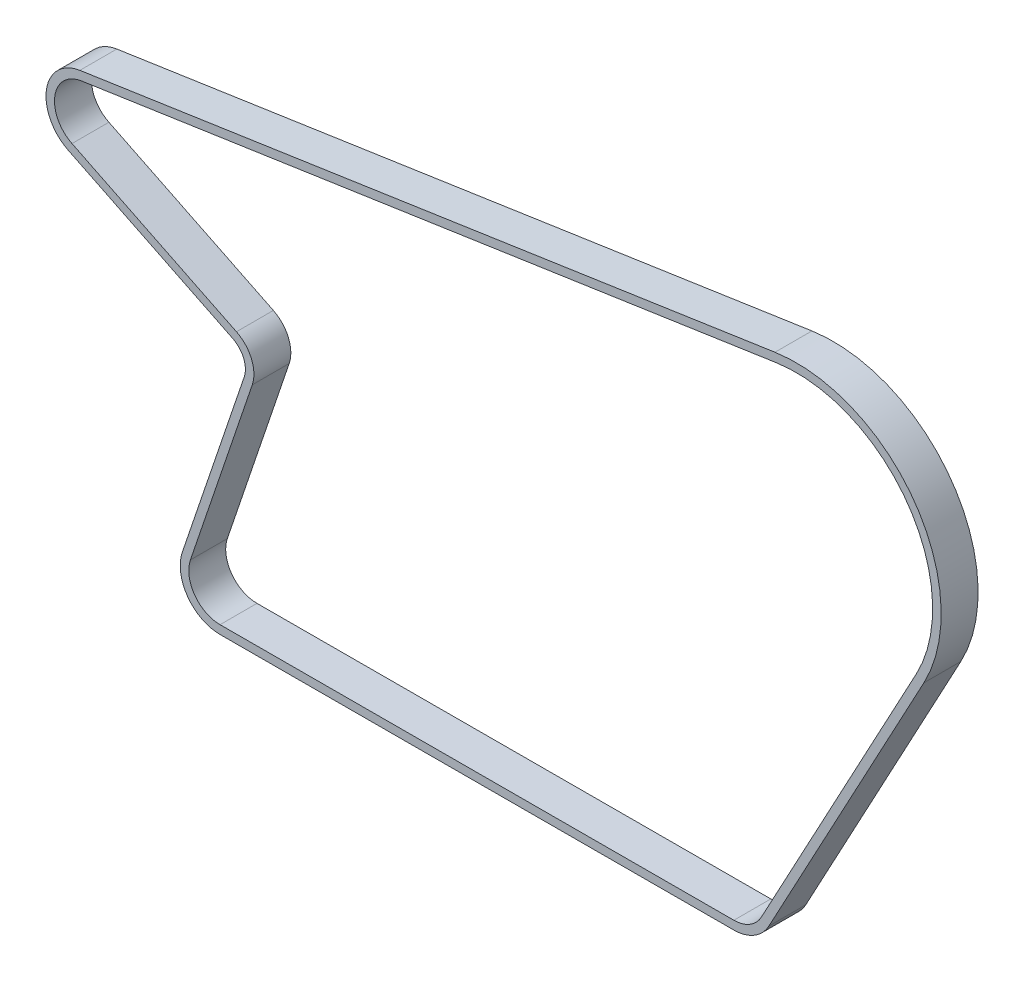
ISO-10303-21;
HEADER;
FILE_DESCRIPTION(('STEP AP214'),'2;1');
FILE_NAME('part.step','',(''),(''),'','','');
FILE_SCHEMA(('AUTOMOTIVE_DESIGN { 1 0 10303 214 1 1 1 1 }'));
ENDSEC;
DATA;
#1=APPLICATION_CONTEXT('core data for automotive mechanical design processes');
#2=APPLICATION_PROTOCOL_DEFINITION('international standard','automotive_design',2000,#1);
#3=PRODUCT_CONTEXT('',#1,'mechanical');
#4=PRODUCT('Part','Part','',(#3));
#5=PRODUCT_RELATED_PRODUCT_CATEGORY('part','',(#4));
#6=PRODUCT_DEFINITION_FORMATION('','',#4);
#7=PRODUCT_DEFINITION_CONTEXT('part definition',#1,'design');
#8=PRODUCT_DEFINITION('design','',#6,#7);
#9=PRODUCT_DEFINITION_SHAPE('','',#8);
#10=(LENGTH_UNIT() NAMED_UNIT(*) SI_UNIT(.MILLI.,.METRE.));
#11=(NAMED_UNIT(*) PLANE_ANGLE_UNIT() SI_UNIT($,.RADIAN.));
#12=(NAMED_UNIT(*) SI_UNIT($,.STERADIAN.) SOLID_ANGLE_UNIT());
#13=UNCERTAINTY_MEASURE_WITH_UNIT(LENGTH_MEASURE(1.E-05),#10,'distance_accuracy_value','');
#14=(GEOMETRIC_REPRESENTATION_CONTEXT(3) GLOBAL_UNCERTAINTY_ASSIGNED_CONTEXT((#13)) GLOBAL_UNIT_ASSIGNED_CONTEXT((#10,
#11,#12)) REPRESENTATION_CONTEXT('',''));
#15=CARTESIAN_POINT('',(0.,0.,0.));
#16=DIRECTION('',(0.,0.,1.));
#17=DIRECTION('',(1.,0.,0.));
#18=AXIS2_PLACEMENT_3D('',#15,#16,#17);
#19=CARTESIAN_POINT('',(-2.80678258413047E-09,-5.82048298447546E-10,-3.));
#20=DIRECTION('',(0.,0.,1.));
#21=DIRECTION('',(1.,0.,0.));
#22=AXIS2_PLACEMENT_3D('',#19,#20,#21);
#23=CYLINDRICAL_SURFACE('',#22,14.);
#24=DIRECTION('',(0.,0.,1.));
#25=VECTOR('',#24,1.);
#26=CARTESIAN_POINT('',(-6.16977134039915,-12.5671763597259,-3.00000000000001));
#27=LINE('',#26,#25);
#28=CARTESIAN_POINT('',(-6.16977134039915,-12.5671763597259,-3.00000000000001));
#29=VERTEX_POINT('',#28);
#30=CARTESIAN_POINT('',(-6.16977134039915,-12.5671763597259,9.99999999999999));
#31=VERTEX_POINT('',#30);
#32=EDGE_CURVE('E160',#29,#31,#27,.T.);
#33=ORIENTED_EDGE('',*,*,#32,.T.);
#34=CARTESIAN_POINT('',(-2.80678258413047E-09,-5.82048298447546E-10,10.));
#35=DIRECTION('',(0.,0.,1.));
#36=DIRECTION('',(1.,0.,0.));
#37=AXIS2_PLACEMENT_3D('',#34,#35,#36);
#38=CIRCLE('',#37,14.);
#39=CARTESIAN_POINT('',(-2.06043363480848,13.8475489972773,10.));
#40=VERTEX_POINT('',#39);
#41=EDGE_CURVE('E343',#40,#31,#38,.T.);
#42=ORIENTED_EDGE('',*,*,#41,.F.);
#43=DIRECTION('',(0.,0.,1.));
#44=VECTOR('',#43,1.);
#45=CARTESIAN_POINT('',(-2.06043363480848,13.8475489972773,-3.));
#46=LINE('',#45,#44);
#47=CARTESIAN_POINT('',(-2.06043363480848,13.8475489972773,-3.));
#48=VERTEX_POINT('',#47);
#49=EDGE_CURVE('E12',#48,#40,#46,.T.);
#50=ORIENTED_EDGE('',*,*,#49,.F.);
#51=CARTESIAN_POINT('',(-2.80678258413047E-09,-5.82048298447546E-10,-3.));
#52=DIRECTION('',(0.,0.,1.));
#53=DIRECTION('',(1.,0.,0.));
#54=AXIS2_PLACEMENT_3D('',#51,#52,#53);
#55=CIRCLE('',#54,14.);
#56=EDGE_CURVE('E398',#48,#29,#55,.T.);
#57=ORIENTED_EDGE('',*,*,#56,.T.);
#58=EDGE_LOOP('',(#33,#42,#50,#57));
#59=FACE_BOUND('',#58,.T.);
#60=ADVANCED_FACE('F157',(#59),#23,.T.);
#61=CARTESIAN_POINT('',(242.697793622884,50.2661298760184,-3.));
#62=DIRECTION('',(-0.147173830857266,0.989110642704241,0.));
#63=DIRECTION('',(-0.989110642704241,-0.147173830857266,0.));
#64=AXIS2_PLACEMENT_3D('',#61,#62,#63);
#65=PLANE('',#64);
#66=ORIENTED_EDGE('',*,*,#49,.T.);
#67=DIRECTION('',(-0.989110642704241,-0.147173830857266,0.));
#68=VECTOR('',#67,1.);
#69=CARTESIAN_POINT('',(242.697793622884,50.2661298760184,10.));
#70=LINE('',#69,#68);
#71=CARTESIAN_POINT('',(242.697793622884,50.2661298760184,10.));
#72=VERTEX_POINT('',#71);
#73=EDGE_CURVE('E370',#72,#40,#70,.T.);
#74=ORIENTED_EDGE('',*,*,#73,.F.);
#75=DIRECTION('',(0.,0.,1.));
#76=VECTOR('',#75,1.);
#77=CARTESIAN_POINT('',(242.697793622884,50.2661298760184,-3.));
#78=LINE('',#77,#76);
#79=CARTESIAN_POINT('',(242.697793622884,50.2661298760184,-3.));
#80=VERTEX_POINT('',#79);
#81=EDGE_CURVE('E165',#80,#72,#78,.T.);
#82=ORIENTED_EDGE('',*,*,#81,.F.);
#83=DIRECTION('',(-0.989110642704241,-0.147173830857266,0.));
#84=VECTOR('',#83,1.);
#85=CARTESIAN_POINT('',(242.697793622884,50.2661298760184,-3.));
#86=LINE('',#85,#84);
#87=EDGE_CURVE('E439',#80,#48,#86,.T.);
#88=ORIENTED_EDGE('',*,*,#87,.T.);
#89=EDGE_LOOP('',(#66,#74,#82,#88));
#90=FACE_BOUND('',#89,.T.);
#91=ADVANCED_FACE('F464',(#90),#65,.T.);
#92=CARTESIAN_POINT('',(250.203658996605,-0.178512901897854,-3.));
#93=DIRECTION('',(0.,0.,1.));
#94=DIRECTION('',(1.,0.,0.));
#95=AXIS2_PLACEMENT_3D('',#92,#93,#94);
#96=CYLINDRICAL_SURFACE('',#95,51.);
#97=ORIENTED_EDGE('',*,*,#81,.T.);
#98=CARTESIAN_POINT('',(250.203658996605,-0.178512901897854,10.));
#99=DIRECTION('',(0.,0.,1.));
#100=DIRECTION('',(1.,0.,0.));
#101=AXIS2_PLACEMENT_3D('',#98,#99,#100);
#102=CIRCLE('',#101,51.);
#103=CARTESIAN_POINT('',(295.117855973604,-24.3387055731352,10.));
#104=VERTEX_POINT('',#103);
#105=EDGE_CURVE('E367',#104,#72,#102,.T.);
#106=ORIENTED_EDGE('',*,*,#105,.F.);
#107=DIRECTION('',(0.,0.,1.));
#108=VECTOR('',#107,1.);
#109=CARTESIAN_POINT('',(295.117855973604,-24.3387055731352,-3.));
#110=LINE('',#109,#108);
#111=CARTESIAN_POINT('',(295.117855973604,-24.3387055731352,-3.));
#112=VERTEX_POINT('',#111);
#113=EDGE_CURVE('E443',#112,#104,#110,.T.);
#114=ORIENTED_EDGE('',*,*,#113,.F.);
#115=CARTESIAN_POINT('',(250.203658996605,-0.178512901897854,-3.));
#116=DIRECTION('',(0.,0.,1.));
#117=DIRECTION('',(1.,0.,0.));
#118=AXIS2_PLACEMENT_3D('',#115,#116,#117);
#119=CIRCLE('',#118,51.);
#120=EDGE_CURVE('E436',#112,#80,#119,.T.);
#121=ORIENTED_EDGE('',*,*,#120,.T.);
#122=EDGE_LOOP('',(#97,#106,#114,#121));
#123=FACE_BOUND('',#122,.T.);
#124=ADVANCED_FACE('F493',(#123),#96,.T.);
#125=CARTESIAN_POINT('',(240.534146402057,-125.810722654787,-3.));
#126=DIRECTION('',(0.88067052896077,-0.473729268063478,0.));
#127=DIRECTION('',(0.473729268063478,0.88067052896077,0.));
#128=AXIS2_PLACEMENT_3D('',#125,#126,#127);
#129=PLANE('',#128);
#130=ORIENTED_EDGE('',*,*,#113,.T.);
#131=DIRECTION('',(0.473729268063478,0.88067052896077,0.));
#132=VECTOR('',#131,1.);
#133=CARTESIAN_POINT('',(240.534146402057,-125.810722654787,10.));
#134=LINE('',#133,#132);
#135=CARTESIAN_POINT('',(240.534146402057,-125.810722654787,10.));
#136=VERTEX_POINT('',#135);
#137=EDGE_CURVE('E364',#136,#104,#134,.T.);
#138=ORIENTED_EDGE('',*,*,#137,.F.);
#139=DIRECTION('',(0.,0.,1.));
#140=VECTOR('',#139,1.);
#141=CARTESIAN_POINT('',(240.534146402057,-125.810722654787,-3.));
#142=LINE('',#141,#140);
#143=CARTESIAN_POINT('',(240.534146402057,-125.810722654787,-3.));
#144=VERTEX_POINT('',#143);
#145=EDGE_CURVE('E445',#144,#136,#142,.T.);
#146=ORIENTED_EDGE('',*,*,#145,.F.);
#147=DIRECTION('',(0.473729268063478,0.88067052896077,0.));
#148=VECTOR('',#147,1.);
#149=CARTESIAN_POINT('',(240.534146402057,-125.810722654787,-3.));
#150=LINE('',#149,#148);
#151=EDGE_CURVE('E433',#144,#112,#150,.T.);
#152=ORIENTED_EDGE('',*,*,#151,.T.);
#153=EDGE_LOOP('',(#130,#138,#146,#152));
#154=FACE_BOUND('',#153,.T.);
#155=ADVANCED_FACE('F491',(#154),#129,.T.);
#156=CARTESIAN_POINT('',(228.204758996606,-119.178512901898,-3.));
#157=DIRECTION('',(0.,0.,1.));
#158=DIRECTION('',(1.,0.,0.));
#159=AXIS2_PLACEMENT_3D('',#156,#157,#158);
#160=CYLINDRICAL_SURFACE('',#159,14.);
#161=ORIENTED_EDGE('',*,*,#145,.T.);
#162=CARTESIAN_POINT('',(228.204758996606,-119.178512901898,10.));
#163=DIRECTION('',(0.,0.,1.));
#164=DIRECTION('',(1.,0.,0.));
#165=AXIS2_PLACEMENT_3D('',#162,#163,#164);
#166=CIRCLE('',#165,14.);
#167=CARTESIAN_POINT('',(228.230752901814,-133.178488770338,10.));
#168=VERTEX_POINT('',#167);
#169=EDGE_CURVE('E361',#168,#136,#166,.T.);
#170=ORIENTED_EDGE('',*,*,#169,.F.);
#171=DIRECTION('',(0.,0.,1.));
#172=VECTOR('',#171,1.);
#173=CARTESIAN_POINT('',(228.230752901814,-133.178488770338,-3.));
#174=LINE('',#173,#172);
#175=CARTESIAN_POINT('',(228.230752901814,-133.178488770338,-3.));
#176=VERTEX_POINT('',#175);
#177=EDGE_CURVE('E447',#176,#168,#174,.T.);
#178=ORIENTED_EDGE('',*,*,#177,.F.);
#179=CARTESIAN_POINT('',(228.204758996606,-119.178512901898,-3.));
#180=DIRECTION('',(0.,0.,1.));
#181=DIRECTION('',(1.,0.,0.));
#182=AXIS2_PLACEMENT_3D('',#179,#180,#181);
#183=CIRCLE('',#182,14.);
#184=EDGE_CURVE('E430',#176,#144,#183,.T.);
#185=ORIENTED_EDGE('',*,*,#184,.T.);
#186=EDGE_LOOP('',(#161,#170,#178,#185));
#187=FACE_BOUND('',#186,.T.);
#188=ADVANCED_FACE('F489',(#187),#160,.T.);
#189=CARTESIAN_POINT('',(47.2980577758592,-133.514428444123,-3.));
#190=DIRECTION('',(0.00185670751490131,-0.999998276317116,0.));
#191=DIRECTION('',(0.999998276317117,0.00185670751490131,0.));
#192=AXIS2_PLACEMENT_3D('',#189,#190,#191);
#193=PLANE('',#192);
#194=ORIENTED_EDGE('',*,*,#177,.T.);
#195=DIRECTION('',(0.999998276317117,0.00185670751490131,0.));
#196=VECTOR('',#195,1.);
#197=CARTESIAN_POINT('',(47.2980577758592,-133.514428444123,10.));
#198=LINE('',#197,#196);
#199=CARTESIAN_POINT('',(47.2980577758592,-133.514428444123,10.));
#200=VERTEX_POINT('',#199);
#201=EDGE_CURVE('E358',#200,#168,#198,.T.);
#202=ORIENTED_EDGE('',*,*,#201,.F.);
#203=DIRECTION('',(0.,0.,1.));
#204=VECTOR('',#203,1.);
#205=CARTESIAN_POINT('',(47.2980577758592,-133.514428444123,-3.));
#206=LINE('',#205,#204);
#207=CARTESIAN_POINT('',(47.2980577758592,-133.514428444123,-3.));
#208=VERTEX_POINT('',#207);
#209=EDGE_CURVE('E449',#208,#200,#206,.T.);
#210=ORIENTED_EDGE('',*,*,#209,.F.);
#211=DIRECTION('',(0.999998276317117,0.00185670751490131,0.));
#212=VECTOR('',#211,1.);
#213=CARTESIAN_POINT('',(47.2980577758592,-133.514428444123,-3.));
#214=LINE('',#213,#212);
#215=EDGE_CURVE('E427',#208,#176,#214,.T.);
#216=ORIENTED_EDGE('',*,*,#215,.T.);
#217=EDGE_LOOP('',(#194,#202,#210,#216));
#218=FACE_BOUND('',#217,.T.);
#219=ADVANCED_FACE('F484',(#218),#193,.T.);
#220=CARTESIAN_POINT('',(47.2720638706506,-119.514452575683,-3.));
#221=DIRECTION('',(0.,0.,1.));
#222=DIRECTION('',(1.,0.,0.));
#223=AXIS2_PLACEMENT_3D('',#220,#221,#222);
#224=CYLINDRICAL_SURFACE('',#223,14.);
#225=ORIENTED_EDGE('',*,*,#209,.T.);
#226=CARTESIAN_POINT('',(47.2720638706506,-119.514452575683,10.));
#227=DIRECTION('',(0.,0.,1.));
#228=DIRECTION('',(1.,0.,0.));
#229=AXIS2_PLACEMENT_3D('',#226,#227,#228);
#230=CIRCLE('',#229,14.);
#231=CARTESIAN_POINT('',(34.0124932172037,-115.021815701168,10.));
#232=VERTEX_POINT('',#231);
#233=EDGE_CURVE('E355',#232,#200,#230,.T.);
#234=ORIENTED_EDGE('',*,*,#233,.F.);
#235=DIRECTION('',(0.,0.,1.));
#236=VECTOR('',#235,1.);
#237=CARTESIAN_POINT('',(34.0124932172037,-115.021815701168,-3.));
#238=LINE('',#237,#236);
#239=CARTESIAN_POINT('',(34.0124932172037,-115.021815701168,-3.));
#240=VERTEX_POINT('',#239);
#241=EDGE_CURVE('E451',#240,#232,#238,.T.);
#242=ORIENTED_EDGE('',*,*,#241,.F.);
#243=CARTESIAN_POINT('',(47.2720638706506,-119.514452575683,-3.));
#244=DIRECTION('',(0.,0.,1.));
#245=DIRECTION('',(1.,0.,0.));
#246=AXIS2_PLACEMENT_3D('',#243,#244,#245);
#247=CIRCLE('',#246,14.);
#248=EDGE_CURVE('E424',#240,#208,#247,.T.);
#249=ORIENTED_EDGE('',*,*,#248,.T.);
#250=EDGE_LOOP('',(#225,#234,#242,#249));
#251=FACE_BOUND('',#250,.T.);
#252=ADVANCED_FACE('F480',(#251),#224,.T.);
#253=CARTESIAN_POINT('',(55.7906565128611,-50.7457339730524,-3.));
#254=DIRECTION('',(-0.947112189531916,0.320902633893926,0.));
#255=DIRECTION('',(-0.320902633893926,-0.947112189531917,0.));
#256=AXIS2_PLACEMENT_3D('',#253,#254,#255);
#257=PLANE('',#256);
#258=ORIENTED_EDGE('',*,*,#241,.T.);
#259=DIRECTION('',(-0.320902633893926,-0.947112189531917,0.));
#260=VECTOR('',#259,1.);
#261=CARTESIAN_POINT('',(55.7906565128611,-50.7457339730524,10.));
#262=LINE('',#261,#260);
#263=CARTESIAN_POINT('',(55.7906565128611,-50.7457339730524,10.));
#264=VERTEX_POINT('',#263);
#265=EDGE_CURVE('E352',#264,#232,#262,.T.);
#266=ORIENTED_EDGE('',*,*,#265,.F.);
#267=DIRECTION('',(0.,0.,1.));
#268=VECTOR('',#267,1.);
#269=CARTESIAN_POINT('',(55.7906565128611,-50.7457339730524,-3.));
#270=LINE('',#269,#268);
#271=CARTESIAN_POINT('',(55.7906565128611,-50.7457339730524,-3.));
#272=VERTEX_POINT('',#271);
#273=EDGE_CURVE('E453',#272,#264,#270,.T.);
#274=ORIENTED_EDGE('',*,*,#273,.F.);
#275=DIRECTION('',(-0.320902633893926,-0.947112189531917,0.));
#276=VECTOR('',#275,1.);
#277=CARTESIAN_POINT('',(55.7906565128611,-50.7457339730524,-3.));
#278=LINE('',#277,#276);
#279=EDGE_CURVE('E421',#272,#240,#278,.T.);
#280=ORIENTED_EDGE('',*,*,#279,.T.);
#281=EDGE_LOOP('',(#258,#266,#274,#280));
#282=FACE_BOUND('',#281,.T.);
#283=ADVANCED_FACE('F478',(#282),#257,.T.);
#284=CARTESIAN_POINT('',(48.2137589966058,-48.178512901901,-3.));
#285=DIRECTION('',(0.,0.,1.));
#286=DIRECTION('',(1.,0.,0.));
#287=AXIS2_PLACEMENT_3D('',#284,#285,#286);
#288=CYLINDRICAL_SURFACE('',#287,8.);
#289=ORIENTED_EDGE('',*,*,#273,.T.);
#290=CARTESIAN_POINT('',(48.2137589966058,-48.178512901901,10.));
#291=DIRECTION('',(0.,0.,1.));
#292=DIRECTION('',(1.,0.,0.));
#293=AXIS2_PLACEMENT_3D('',#290,#291,#292);
#294=CIRCLE('',#293,8.);
#295=CARTESIAN_POINT('',(51.7393426180872,-40.9972692681045,9.99999999999999));
#296=VERTEX_POINT('',#295);
#297=EDGE_CURVE('E349',#296,#264,#294,.F.);
#298=ORIENTED_EDGE('',*,*,#297,.F.);
#299=DIRECTION('',(0.,0.,1.));
#300=VECTOR('',#299,1.);
#301=CARTESIAN_POINT('',(51.7393426180872,-40.9972692681045,-3.00000000000001));
#302=LINE('',#301,#300);
#303=CARTESIAN_POINT('',(51.7393426180872,-40.9972692681045,-3.00000000000001));
#304=VERTEX_POINT('',#303);
#305=EDGE_CURVE('E454',#304,#296,#302,.T.);
#306=ORIENTED_EDGE('',*,*,#305,.F.);
#307=CARTESIAN_POINT('',(48.2137589966058,-48.178512901901,-3.));
#308=DIRECTION('',(0.,0.,1.));
#309=DIRECTION('',(1.,0.,0.));
#310=AXIS2_PLACEMENT_3D('',#307,#308,#309);
#311=CIRCLE('',#310,8.);
#312=EDGE_CURVE('E418',#304,#272,#311,.F.);
#313=ORIENTED_EDGE('',*,*,#312,.T.);
#314=EDGE_LOOP('',(#289,#298,#306,#313));
#315=FACE_BOUND('',#314,.T.);
#316=ADVANCED_FACE('F474',(#315),#288,.F.);
#317=CARTESIAN_POINT('',(-6.16977134039915,-12.5671763597259,-3.));
#318=DIRECTION('',(-0.440697952685169,-0.89765545422456,0.));
#319=DIRECTION('',(0.89765545422456,-0.440697952685169,0.));
#320=AXIS2_PLACEMENT_3D('',#317,#318,#319);
#321=PLANE('',#320);
#322=ORIENTED_EDGE('',*,*,#305,.T.);
#323=DIRECTION('',(0.89765545422456,-0.440697952685169,0.));
#324=VECTOR('',#323,1.);
#325=CARTESIAN_POINT('',(-6.16977134039915,-12.5671763597259,10.));
#326=LINE('',#325,#324);
#327=EDGE_CURVE('E346',#31,#296,#326,.T.);
#328=ORIENTED_EDGE('',*,*,#327,.F.);
#329=ORIENTED_EDGE('',*,*,#32,.F.);
#330=DIRECTION('',(0.89765545422456,-0.440697952685169,0.));
#331=VECTOR('',#330,1.);
#332=CARTESIAN_POINT('',(-6.16977134039915,-12.5671763597259,-3.));
#333=LINE('',#332,#331);
#334=EDGE_CURVE('E415',#29,#304,#333,.T.);
#335=ORIENTED_EDGE('',*,*,#334,.T.);
#336=EDGE_LOOP('',(#322,#328,#329,#335));
#337=FACE_BOUND('',#336,.T.);
#338=ADVANCED_FACE('F458',(#337),#321,.T.);
#339=CARTESIAN_POINT('',(-2.80678258413047E-09,-5.82048298447546E-10,-3.));
#340=DIRECTION('',(0.,0.,1.));
#341=DIRECTION('',(1.,0.,0.));
#342=AXIS2_PLACEMENT_3D('',#339,#340,#341);
#343=PLANE('',#342);
#344=DIRECTION('',(-0.989110642704241,-0.147173830857266,0.));
#345=VECTOR('',#344,1.);
#346=CARTESIAN_POINT('',(243.139315115456,47.2987979479057,-3.));
#347=LINE('',#346,#345);
#348=CARTESIAN_POINT('',(243.139315115456,47.2987979479057,-3.));
#349=VERTEX_POINT('',#348);
#350=CARTESIAN_POINT('',(-1.61891214223671,10.8802170691646,-3.));
#351=VERTEX_POINT('',#350);
#352=EDGE_CURVE('E306',#349,#351,#347,.T.);
#353=ORIENTED_EDGE('',*,*,#352,.T.);
#354=CARTESIAN_POINT('',(-2.80678258413047E-09,-5.82048298447546E-10,-3.));
#355=DIRECTION('',(0.,0.,1.));
#356=DIRECTION('',(1.,0.,0.));
#357=AXIS2_PLACEMENT_3D('',#354,#355,#356);
#358=CIRCLE('',#357,11.);
#359=CARTESIAN_POINT('',(-4.84767748234364,-9.8742099970522,-3.));
#360=VERTEX_POINT('',#359);
#361=EDGE_CURVE('E373',#351,#360,#358,.T.);
#362=ORIENTED_EDGE('',*,*,#361,.T.);
#363=DIRECTION('',(0.89765545422456,-0.440697952685169,0.));
#364=VECTOR('',#363,1.);
#365=CARTESIAN_POINT('',(-4.84767748234364,-9.8742099970522,-3.));
#366=LINE('',#365,#364);
#367=CARTESIAN_POINT('',(53.0614364761426,-38.3043029054308,-3.));
#368=VERTEX_POINT('',#367);
#369=EDGE_CURVE('E301',#360,#368,#366,.T.);
#370=ORIENTED_EDGE('',*,*,#369,.T.);
#371=CARTESIAN_POINT('',(48.2137589966058,-48.178512901901,-3.));
#372=DIRECTION('',(0.,0.,-1.));
#373=DIRECTION('',(-1.,0.,0.));
#374=AXIS2_PLACEMENT_3D('',#371,#372,#373);
#375=CIRCLE('',#374,11.);
#376=CARTESIAN_POINT('',(58.6319930814568,-51.7084418747342,-3.));
#377=VERTEX_POINT('',#376);
#378=EDGE_CURVE('E173',#368,#377,#375,.T.);
#379=ORIENTED_EDGE('',*,*,#378,.T.);
#380=DIRECTION('',(-0.320902633893926,-0.947112189531917,0.));
#381=VECTOR('',#380,1.);
#382=CARTESIAN_POINT('',(58.6319930814568,-51.7084418747342,-3.));
#383=LINE('',#382,#381);
#384=CARTESIAN_POINT('',(36.8538297857995,-115.98452360285,-3.));
#385=VERTEX_POINT('',#384);
#386=EDGE_CURVE('E377',#377,#385,#383,.T.);
#387=ORIENTED_EDGE('',*,*,#386,.T.);
#388=CARTESIAN_POINT('',(47.2720638706506,-119.514452575683,-3.));
#389=DIRECTION('',(0.,0.,1.));
#390=DIRECTION('',(1.,0.,0.));
#391=AXIS2_PLACEMENT_3D('',#388,#389,#390);
#392=CIRCLE('',#391,11.);
#393=CARTESIAN_POINT('',(47.2924876533145,-130.514433615172,-3.));
#394=VERTEX_POINT('',#393);
#395=EDGE_CURVE('E380',#385,#394,#392,.T.);
#396=ORIENTED_EDGE('',*,*,#395,.T.);
#397=DIRECTION('',(0.999998276317116,0.00185670751490131,0.));
#398=VECTOR('',#397,1.);
#399=CARTESIAN_POINT('',(47.2924876533145,-130.514433615172,-3.));
#400=LINE('',#399,#398);
#401=CARTESIAN_POINT('',(228.22518277927,-130.178493941386,-3.));
#402=VERTEX_POINT('',#401);
#403=EDGE_CURVE('E383',#394,#402,#400,.T.);
#404=ORIENTED_EDGE('',*,*,#403,.T.);
#405=CARTESIAN_POINT('',(228.204758996606,-119.178512901898,-3.));
#406=DIRECTION('',(0.,0.,1.));
#407=DIRECTION('',(1.,0.,0.));
#408=AXIS2_PLACEMENT_3D('',#405,#406,#407);
#409=CIRCLE('',#408,11.);
#410=CARTESIAN_POINT('',(237.892134815174,-124.389534850596,-3.));
#411=VERTEX_POINT('',#410);
#412=EDGE_CURVE('E386',#402,#411,#409,.T.);
#413=ORIENTED_EDGE('',*,*,#412,.T.);
#414=DIRECTION('',(0.473729268063478,0.88067052896077,0.));
#415=VECTOR('',#414,1.);
#416=CARTESIAN_POINT('',(237.892134815174,-124.389534850596,-3.));
#417=LINE('',#416,#415);
#418=CARTESIAN_POINT('',(292.475844386722,-22.9175177689448,-3.));
#419=VERTEX_POINT('',#418);
#420=EDGE_CURVE('E389',#411,#419,#417,.T.);
#421=ORIENTED_EDGE('',*,*,#420,.T.);
#422=CARTESIAN_POINT('',(250.203658996605,-0.178512901897854,-3.));
#423=DIRECTION('',(0.,0.,1.));
#424=DIRECTION('',(1.,0.,0.));
#425=AXIS2_PLACEMENT_3D('',#422,#423,#424);
#426=CIRCLE('',#425,48.);
#427=EDGE_CURVE('E392',#419,#349,#426,.T.);
#428=ORIENTED_EDGE('',*,*,#427,.T.);
#429=EDGE_LOOP('',(#353,#362,#370,#379,#387,#396,#404,#413,#421,#428));
#430=FACE_BOUND('',#429,.T.);
#431=ORIENTED_EDGE('',*,*,#56,.F.);
#432=ORIENTED_EDGE('',*,*,#87,.F.);
#433=ORIENTED_EDGE('',*,*,#120,.F.);
#434=ORIENTED_EDGE('',*,*,#151,.F.);
#435=ORIENTED_EDGE('',*,*,#184,.F.);
#436=ORIENTED_EDGE('',*,*,#215,.F.);
#437=ORIENTED_EDGE('',*,*,#248,.F.);
#438=ORIENTED_EDGE('',*,*,#279,.F.);
#439=ORIENTED_EDGE('',*,*,#312,.F.);
#440=ORIENTED_EDGE('',*,*,#334,.F.);
#441=EDGE_LOOP('',(#431,#432,#433,#434,#435,#436,#437,#438,#439,#440));
#442=FACE_BOUND('',#441,.T.);
#443=ADVANCED_FACE('F468',(#430,#442),#343,.F.);
#444=CARTESIAN_POINT('',(-2.80678258413047E-09,-5.82048298447546E-10,-3.));
#445=DIRECTION('',(0.,0.,1.));
#446=DIRECTION('',(1.,0.,0.));
#447=AXIS2_PLACEMENT_3D('',#444,#445,#446);
#448=CYLINDRICAL_SURFACE('',#447,11.);
#449=DIRECTION('',(0.,0.,1.));
#450=VECTOR('',#449,1.);
#451=CARTESIAN_POINT('',(-1.61891214223671,10.8802170691646,-3.));
#452=LINE('',#451,#450);
#453=CARTESIAN_POINT('',(-1.61891214223671,10.8802170691646,10.));
#454=VERTEX_POINT('',#453);
#455=EDGE_CURVE('E311',#351,#454,#452,.T.);
#456=ORIENTED_EDGE('',*,*,#455,.T.);
#457=CARTESIAN_POINT('',(-2.80678258413047E-09,-5.82048298447546E-10,10.));
#458=DIRECTION('',(0.,0.,1.));
#459=DIRECTION('',(1.,0.,0.));
#460=AXIS2_PLACEMENT_3D('',#457,#458,#459);
#461=CIRCLE('',#460,11.);
#462=CARTESIAN_POINT('',(-4.84767748234364,-9.8742099970522,10.));
#463=VERTEX_POINT('',#462);
#464=EDGE_CURVE('E309',#454,#463,#461,.T.);
#465=ORIENTED_EDGE('',*,*,#464,.T.);
#466=DIRECTION('',(0.,0.,1.));
#467=VECTOR('',#466,1.);
#468=CARTESIAN_POINT('',(-4.84767748234364,-9.8742099970522,-3.));
#469=LINE('',#468,#467);
#470=EDGE_CURVE('E294',#360,#463,#469,.T.);
#471=ORIENTED_EDGE('',*,*,#470,.F.);
#472=ORIENTED_EDGE('',*,*,#361,.F.);
#473=EDGE_LOOP('',(#456,#465,#471,#472));
#474=FACE_BOUND('',#473,.T.);
#475=ADVANCED_FACE('F310',(#474),#448,.F.);
#476=CARTESIAN_POINT('',(243.139315115456,47.2987979479057,-3.));
#477=DIRECTION('',(-0.147173830857266,0.989110642704241,0.));
#478=DIRECTION('',(-0.989110642704241,-0.147173830857266,0.));
#479=AXIS2_PLACEMENT_3D('',#476,#477,#478);
#480=PLANE('',#479);
#481=DIRECTION('',(0.,0.,1.));
#482=VECTOR('',#481,1.);
#483=CARTESIAN_POINT('',(243.139315115456,47.2987979479057,-3.));
#484=LINE('',#483,#482);
#485=CARTESIAN_POINT('',(243.139315115456,47.2987979479057,10.));
#486=VERTEX_POINT('',#485);
#487=EDGE_CURVE('E399',#349,#486,#484,.T.);
#488=ORIENTED_EDGE('',*,*,#487,.T.);
#489=DIRECTION('',(-0.989110642704241,-0.147173830857266,0.));
#490=VECTOR('',#489,1.);
#491=CARTESIAN_POINT('',(243.139315115456,47.2987979479057,10.));
#492=LINE('',#491,#490);
#493=EDGE_CURVE('E341',#486,#454,#492,.T.);
#494=ORIENTED_EDGE('',*,*,#493,.T.);
#495=ORIENTED_EDGE('',*,*,#455,.F.);
#496=ORIENTED_EDGE('',*,*,#352,.F.);
#497=EDGE_LOOP('',(#488,#494,#495,#496));
#498=FACE_BOUND('',#497,.T.);
#499=ADVANCED_FACE('F584',(#498),#480,.F.);
#500=CARTESIAN_POINT('',(250.203658996605,-0.178512901897854,-3.));
#501=DIRECTION('',(0.,0.,1.));
#502=DIRECTION('',(1.,0.,0.));
#503=AXIS2_PLACEMENT_3D('',#500,#501,#502);
#504=CYLINDRICAL_SURFACE('',#503,48.);
#505=DIRECTION('',(0.,0.,1.));
#506=VECTOR('',#505,1.);
#507=CARTESIAN_POINT('',(292.475844386722,-22.9175177689448,-3.));
#508=LINE('',#507,#506);
#509=CARTESIAN_POINT('',(292.475844386722,-22.9175177689448,10.));
#510=VERTEX_POINT('',#509);
#511=EDGE_CURVE('E401',#419,#510,#508,.T.);
#512=ORIENTED_EDGE('',*,*,#511,.T.);
#513=CARTESIAN_POINT('',(250.203658996605,-0.178512901897854,10.));
#514=DIRECTION('',(0.,0.,1.));
#515=DIRECTION('',(1.,0.,0.));
#516=AXIS2_PLACEMENT_3D('',#513,#514,#515);
#517=CIRCLE('',#516,48.);
#518=EDGE_CURVE('E338',#510,#486,#517,.T.);
#519=ORIENTED_EDGE('',*,*,#518,.T.);
#520=ORIENTED_EDGE('',*,*,#487,.F.);
#521=ORIENTED_EDGE('',*,*,#427,.F.);
#522=EDGE_LOOP('',(#512,#519,#520,#521));
#523=FACE_BOUND('',#522,.T.);
#524=ADVANCED_FACE('F593',(#523),#504,.F.);
#525=CARTESIAN_POINT('',(237.892134815174,-124.389534850596,-3.));
#526=DIRECTION('',(0.880670528960769,-0.473729268063478,0.));
#527=DIRECTION('',(0.473729268063478,0.88067052896077,0.));
#528=AXIS2_PLACEMENT_3D('',#525,#526,#527);
#529=PLANE('',#528);
#530=DIRECTION('',(0.,0.,1.));
#531=VECTOR('',#530,1.);
#532=CARTESIAN_POINT('',(237.892134815174,-124.389534850596,-3.));
#533=LINE('',#532,#531);
#534=CARTESIAN_POINT('',(237.892134815174,-124.389534850596,10.));
#535=VERTEX_POINT('',#534);
#536=EDGE_CURVE('E403',#411,#535,#533,.T.);
#537=ORIENTED_EDGE('',*,*,#536,.T.);
#538=DIRECTION('',(0.473729268063478,0.88067052896077,0.));
#539=VECTOR('',#538,1.);
#540=CARTESIAN_POINT('',(237.892134815174,-124.389534850596,10.));
#541=LINE('',#540,#539);
#542=EDGE_CURVE('E335',#535,#510,#541,.T.);
#543=ORIENTED_EDGE('',*,*,#542,.T.);
#544=ORIENTED_EDGE('',*,*,#511,.F.);
#545=ORIENTED_EDGE('',*,*,#420,.F.);
#546=EDGE_LOOP('',(#537,#543,#544,#545));
#547=FACE_BOUND('',#546,.T.);
#548=ADVANCED_FACE('F603',(#547),#529,.F.);
#549=CARTESIAN_POINT('',(228.204758996606,-119.178512901898,-3.));
#550=DIRECTION('',(0.,0.,1.));
#551=DIRECTION('',(1.,0.,0.));
#552=AXIS2_PLACEMENT_3D('',#549,#550,#551);
#553=CYLINDRICAL_SURFACE('',#552,11.);
#554=DIRECTION('',(0.,0.,1.));
#555=VECTOR('',#554,1.);
#556=CARTESIAN_POINT('',(228.22518277927,-130.178493941386,-3.));
#557=LINE('',#556,#555);
#558=CARTESIAN_POINT('',(228.22518277927,-130.178493941386,10.));
#559=VERTEX_POINT('',#558);
#560=EDGE_CURVE('E405',#402,#559,#557,.T.);
#561=ORIENTED_EDGE('',*,*,#560,.T.);
#562=CARTESIAN_POINT('',(228.204758996606,-119.178512901898,10.));
#563=DIRECTION('',(0.,0.,1.));
#564=DIRECTION('',(1.,0.,0.));
#565=AXIS2_PLACEMENT_3D('',#562,#563,#564);
#566=CIRCLE('',#565,11.);
#567=EDGE_CURVE('E332',#559,#535,#566,.T.);
#568=ORIENTED_EDGE('',*,*,#567,.T.);
#569=ORIENTED_EDGE('',*,*,#536,.F.);
#570=ORIENTED_EDGE('',*,*,#412,.F.);
#571=EDGE_LOOP('',(#561,#568,#569,#570));
#572=FACE_BOUND('',#571,.T.);
#573=ADVANCED_FACE('F613',(#572),#553,.F.);
#574=CARTESIAN_POINT('',(47.2924876533145,-130.514433615172,-3.));
#575=DIRECTION('',(0.00185670751490131,-0.999998276317116,0.));
#576=DIRECTION('',(0.999998276317117,0.00185670751490131,0.));
#577=AXIS2_PLACEMENT_3D('',#574,#575,#576);
#578=PLANE('',#577);
#579=DIRECTION('',(0.,0.,1.));
#580=VECTOR('',#579,1.);
#581=CARTESIAN_POINT('',(47.2924876533145,-130.514433615172,-3.));
#582=LINE('',#581,#580);
#583=CARTESIAN_POINT('',(47.2924876533145,-130.514433615172,10.));
#584=VERTEX_POINT('',#583);
#585=EDGE_CURVE('E407',#394,#584,#582,.T.);
#586=ORIENTED_EDGE('',*,*,#585,.T.);
#587=DIRECTION('',(0.999998276317116,0.00185670751490131,0.));
#588=VECTOR('',#587,1.);
#589=CARTESIAN_POINT('',(47.2924876533145,-130.514433615172,10.));
#590=LINE('',#589,#588);
#591=EDGE_CURVE('E329',#584,#559,#590,.T.);
#592=ORIENTED_EDGE('',*,*,#591,.T.);
#593=ORIENTED_EDGE('',*,*,#560,.F.);
#594=ORIENTED_EDGE('',*,*,#403,.F.);
#595=EDGE_LOOP('',(#586,#592,#593,#594));
#596=FACE_BOUND('',#595,.T.);
#597=ADVANCED_FACE('F623',(#596),#578,.F.);
#598=CARTESIAN_POINT('',(47.2720638706506,-119.514452575683,-3.));
#599=DIRECTION('',(0.,0.,1.));
#600=DIRECTION('',(1.,0.,0.));
#601=AXIS2_PLACEMENT_3D('',#598,#599,#600);
#602=CYLINDRICAL_SURFACE('',#601,11.);
#603=DIRECTION('',(0.,0.,1.));
#604=VECTOR('',#603,1.);
#605=CARTESIAN_POINT('',(36.8538297857995,-115.98452360285,-3.));
#606=LINE('',#605,#604);
#607=CARTESIAN_POINT('',(36.8538297857995,-115.98452360285,10.));
#608=VERTEX_POINT('',#607);
#609=EDGE_CURVE('E409',#385,#608,#606,.T.);
#610=ORIENTED_EDGE('',*,*,#609,.T.);
#611=CARTESIAN_POINT('',(47.2720638706506,-119.514452575683,10.));
#612=DIRECTION('',(0.,0.,1.));
#613=DIRECTION('',(1.,0.,0.));
#614=AXIS2_PLACEMENT_3D('',#611,#612,#613);
#615=CIRCLE('',#614,11.);
#616=EDGE_CURVE('E326',#608,#584,#615,.T.);
#617=ORIENTED_EDGE('',*,*,#616,.T.);
#618=ORIENTED_EDGE('',*,*,#585,.F.);
#619=ORIENTED_EDGE('',*,*,#395,.F.);
#620=EDGE_LOOP('',(#610,#617,#618,#619));
#621=FACE_BOUND('',#620,.T.);
#622=ADVANCED_FACE('F633',(#621),#602,.F.);
#623=CARTESIAN_POINT('',(58.6319930814568,-51.7084418747342,-3.));
#624=DIRECTION('',(-0.947112189531916,0.320902633893926,0.));
#625=DIRECTION('',(-0.320902633893926,-0.947112189531917,0.));
#626=AXIS2_PLACEMENT_3D('',#623,#624,#625);
#627=PLANE('',#626);
#628=DIRECTION('',(0.,0.,1.));
#629=VECTOR('',#628,1.);
#630=CARTESIAN_POINT('',(58.6319930814568,-51.7084418747342,-3.));
#631=LINE('',#630,#629);
#632=CARTESIAN_POINT('',(58.6319930814568,-51.7084418747342,10.));
#633=VERTEX_POINT('',#632);
#634=EDGE_CURVE('E411',#377,#633,#631,.T.);
#635=ORIENTED_EDGE('',*,*,#634,.T.);
#636=DIRECTION('',(-0.320902633893926,-0.947112189531917,0.));
#637=VECTOR('',#636,1.);
#638=CARTESIAN_POINT('',(58.6319930814568,-51.7084418747342,10.));
#639=LINE('',#638,#637);
#640=EDGE_CURVE('E321',#633,#608,#639,.T.);
#641=ORIENTED_EDGE('',*,*,#640,.T.);
#642=ORIENTED_EDGE('',*,*,#609,.F.);
#643=ORIENTED_EDGE('',*,*,#386,.F.);
#644=EDGE_LOOP('',(#635,#641,#642,#643));
#645=FACE_BOUND('',#644,.T.);
#646=ADVANCED_FACE('F643',(#645),#627,.F.);
#647=CARTESIAN_POINT('',(48.2137589966058,-48.178512901901,-3.));
#648=DIRECTION('',(0.,0.,1.));
#649=DIRECTION('',(1.,0.,0.));
#650=AXIS2_PLACEMENT_3D('',#647,#648,#649);
#651=CYLINDRICAL_SURFACE('',#650,11.);
#652=DIRECTION('',(0.,0.,1.));
#653=VECTOR('',#652,1.);
#654=CARTESIAN_POINT('',(53.0614364761426,-38.3043029054308,-3.));
#655=LINE('',#654,#653);
#656=CARTESIAN_POINT('',(53.0614364761426,-38.3043029054308,10.));
#657=VERTEX_POINT('',#656);
#658=EDGE_CURVE('E305',#368,#657,#655,.T.);
#659=ORIENTED_EDGE('',*,*,#658,.T.);
#660=CARTESIAN_POINT('',(48.2137589966058,-48.178512901901,10.));
#661=DIRECTION('',(0.,0.,-1.));
#662=DIRECTION('',(-1.,0.,0.));
#663=AXIS2_PLACEMENT_3D('',#660,#661,#662);
#664=CIRCLE('',#663,11.);
#665=EDGE_CURVE('E319',#657,#633,#664,.T.);
#666=ORIENTED_EDGE('',*,*,#665,.T.);
#667=ORIENTED_EDGE('',*,*,#634,.F.);
#668=ORIENTED_EDGE('',*,*,#378,.F.);
#669=EDGE_LOOP('',(#659,#666,#667,#668));
#670=FACE_BOUND('',#669,.T.);
#671=ADVANCED_FACE('F653',(#670),#651,.T.);
#672=CARTESIAN_POINT('',(-4.84767748234364,-9.8742099970522,-3.));
#673=DIRECTION('',(-0.440697952685169,-0.89765545422456,0.));
#674=DIRECTION('',(0.89765545422456,-0.440697952685169,0.));
#675=AXIS2_PLACEMENT_3D('',#672,#673,#674);
#676=PLANE('',#675);
#677=ORIENTED_EDGE('',*,*,#470,.T.);
#678=DIRECTION('',(0.89765545422456,-0.440697952685169,0.));
#679=VECTOR('',#678,1.);
#680=CARTESIAN_POINT('',(-4.84767748234364,-9.8742099970522,10.));
#681=LINE('',#680,#679);
#682=EDGE_CURVE('E298',#463,#657,#681,.T.);
#683=ORIENTED_EDGE('',*,*,#682,.T.);
#684=ORIENTED_EDGE('',*,*,#658,.F.);
#685=ORIENTED_EDGE('',*,*,#369,.F.);
#686=EDGE_LOOP('',(#677,#683,#684,#685));
#687=FACE_BOUND('',#686,.T.);
#688=ADVANCED_FACE('F296',(#687),#676,.F.);
#689=CARTESIAN_POINT('',(-2.80678258413047E-09,-5.82048298447546E-10,10.));
#690=DIRECTION('',(0.,0.,1.));
#691=DIRECTION('',(1.,0.,0.));
#692=AXIS2_PLACEMENT_3D('',#689,#690,#691);
#693=PLANE('',#692);
#694=ORIENTED_EDGE('',*,*,#41,.T.);
#695=ORIENTED_EDGE('',*,*,#327,.T.);
#696=ORIENTED_EDGE('',*,*,#297,.T.);
#697=ORIENTED_EDGE('',*,*,#265,.T.);
#698=ORIENTED_EDGE('',*,*,#233,.T.);
#699=ORIENTED_EDGE('',*,*,#201,.T.);
#700=ORIENTED_EDGE('',*,*,#169,.T.);
#701=ORIENTED_EDGE('',*,*,#137,.T.);
#702=ORIENTED_EDGE('',*,*,#105,.T.);
#703=ORIENTED_EDGE('',*,*,#73,.T.);
#704=EDGE_LOOP('',(#694,#695,#696,#697,#698,#699,#700,#701,#702,#703));
#705=FACE_BOUND('',#704,.T.);
#706=ORIENTED_EDGE('',*,*,#682,.F.);
#707=ORIENTED_EDGE('',*,*,#464,.F.);
#708=ORIENTED_EDGE('',*,*,#493,.F.);
#709=ORIENTED_EDGE('',*,*,#518,.F.);
#710=ORIENTED_EDGE('',*,*,#542,.F.);
#711=ORIENTED_EDGE('',*,*,#567,.F.);
#712=ORIENTED_EDGE('',*,*,#591,.F.);
#713=ORIENTED_EDGE('',*,*,#616,.F.);
#714=ORIENTED_EDGE('',*,*,#640,.F.);
#715=ORIENTED_EDGE('',*,*,#665,.F.);
#716=EDGE_LOOP('',(#706,#707,#708,#709,#710,#711,#712,#713,#714,#715));
#717=FACE_BOUND('',#716,.T.);
#718=ADVANCED_FACE('F316',(#705,#717),#693,.T.);
#719=CLOSED_SHELL('',(#60,#91,#124,#155,#188,#219,#252,#283,#316,#338,#443,#475,#499,#524,#548,
#573,#597,#622,#646,#671,#688,#718));
#720=MANIFOLD_SOLID_BREP('B2',#719);
#721=ADVANCED_BREP_SHAPE_REPRESENTATION('',(#18,#720),#14);
#722=SHAPE_DEFINITION_REPRESENTATION(#9,#721);
ENDSEC;
END-ISO-10303-21;
